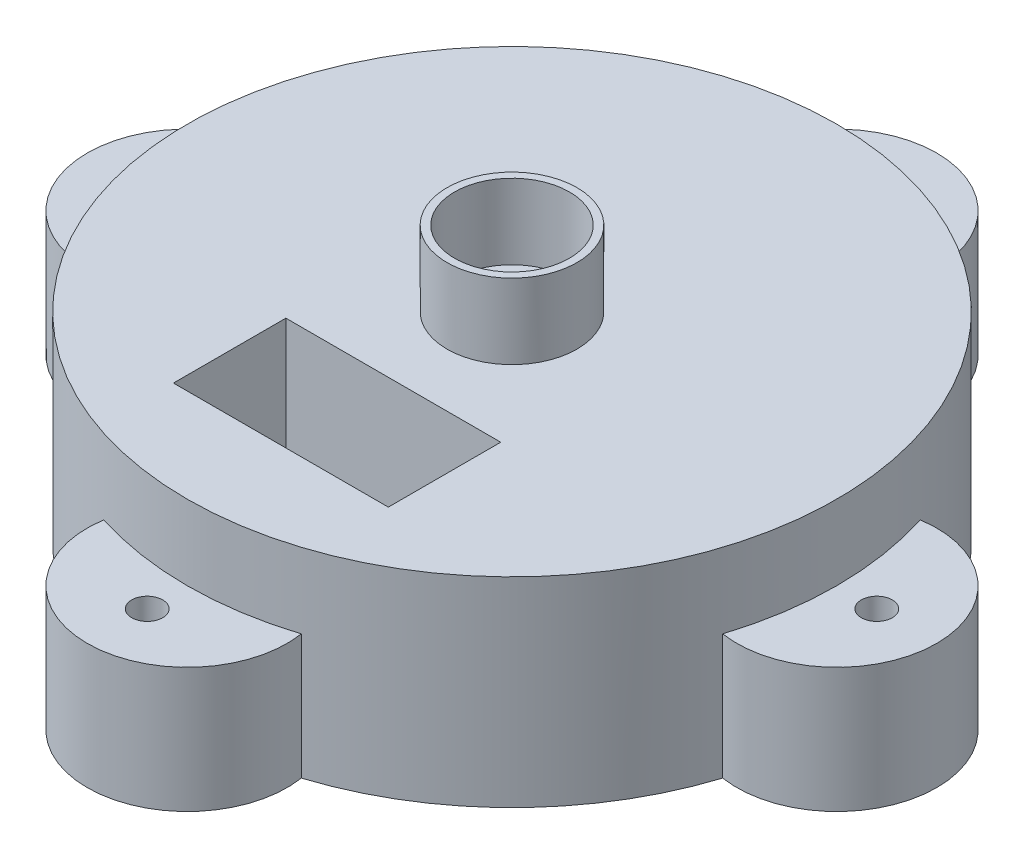
ISO-10303-21;
HEADER;
FILE_DESCRIPTION(('STEP AP214'),'2;1');
FILE_NAME('part.step','',(''),(''),'','','');
FILE_SCHEMA(('AUTOMOTIVE_DESIGN { 1 0 10303 214 1 1 1 1 }'));
ENDSEC;
DATA;
#1=APPLICATION_CONTEXT('core data for automotive mechanical design processes');
#2=APPLICATION_PROTOCOL_DEFINITION('international standard','automotive_design',2000,#1);
#3=PRODUCT_CONTEXT('',#1,'mechanical');
#4=PRODUCT('Part','Part','',(#3));
#5=PRODUCT_RELATED_PRODUCT_CATEGORY('part','',(#4));
#6=PRODUCT_DEFINITION_FORMATION('','',#4);
#7=PRODUCT_DEFINITION_CONTEXT('part definition',#1,'design');
#8=PRODUCT_DEFINITION('design','',#6,#7);
#9=PRODUCT_DEFINITION_SHAPE('','',#8);
#10=(LENGTH_UNIT() NAMED_UNIT(*) SI_UNIT(.MILLI.,.METRE.));
#11=(NAMED_UNIT(*) PLANE_ANGLE_UNIT() SI_UNIT($,.RADIAN.));
#12=(NAMED_UNIT(*) SI_UNIT($,.STERADIAN.) SOLID_ANGLE_UNIT());
#13=UNCERTAINTY_MEASURE_WITH_UNIT(LENGTH_MEASURE(1.E-05),#10,'distance_accuracy_value','');
#14=(GEOMETRIC_REPRESENTATION_CONTEXT(3) GLOBAL_UNCERTAINTY_ASSIGNED_CONTEXT((#13)) GLOBAL_UNIT_ASSIGNED_CONTEXT((#10,
#11,#12)) REPRESENTATION_CONTEXT('',''));
#15=CARTESIAN_POINT('',(0.,0.,0.));
#16=DIRECTION('',(0.,0.,1.));
#17=DIRECTION('',(1.,0.,0.));
#18=AXIS2_PLACEMENT_3D('',#15,#16,#17);
#19=CARTESIAN_POINT('',(0.,40.,0.));
#20=DIRECTION('',(0.,-1.,0.));
#21=DIRECTION('',(0.,0.,-1.));
#22=AXIS2_PLACEMENT_3D('',#19,#20,#21);
#23=CYLINDRICAL_SURFACE('',#22,65.);
#24=DIRECTION('',(0.,-1.,0.));
#25=VECTOR('',#24,1.);
#26=CARTESIAN_POINT('',(61.9230515913332,25.,19.7619756506552));
#27=LINE('',#26,#25);
#28=CARTESIAN_POINT('',(61.9230515913332,25.,19.7619756506552));
#29=VERTEX_POINT('',#28);
#30=CARTESIAN_POINT('',(61.9230515913332,0.,19.7619756506552));
#31=VERTEX_POINT('',#30);
#32=EDGE_CURVE('E202',#29,#31,#27,.T.);
#33=ORIENTED_EDGE('',*,*,#32,.F.);
#34=CARTESIAN_POINT('',(0.,25.,0.));
#35=DIRECTION('',(0.,-1.,0.));
#36=DIRECTION('',(0.,0.,-1.));
#37=AXIS2_PLACEMENT_3D('',#34,#35,#36);
#38=CIRCLE('',#37,65.);
#39=CARTESIAN_POINT('',(61.9231022547189,25.,-19.7618168990512));
#40=VERTEX_POINT('',#39);
#41=EDGE_CURVE('E195',#40,#29,#38,.T.);
#42=ORIENTED_EDGE('',*,*,#41,.F.);
#43=DIRECTION('',(0.,-1.,0.));
#44=VECTOR('',#43,1.);
#45=CARTESIAN_POINT('',(61.9231022547189,25.,-19.7618168990512));
#46=LINE('',#45,#44);
#47=CARTESIAN_POINT('',(61.9231022547189,0.,-19.7618168990512));
#48=VERTEX_POINT('',#47);
#49=EDGE_CURVE('E207',#40,#48,#46,.T.);
#50=ORIENTED_EDGE('',*,*,#49,.T.);
#51=CARTESIAN_POINT('',(0.,0.,0.));
#52=DIRECTION('',(0.,1.,0.));
#53=DIRECTION('',(0.,0.,1.));
#54=AXIS2_PLACEMENT_3D('',#51,#52,#53);
#55=CIRCLE('',#54,65.);
#56=CARTESIAN_POINT('',(19.761975650655,0.,-61.9230515913333));
#57=VERTEX_POINT('',#56);
#58=EDGE_CURVE('E309',#48,#57,#55,.T.);
#59=ORIENTED_EDGE('',*,*,#58,.T.);
#60=DIRECTION('',(0.,-1.,0.));
#61=VECTOR('',#60,1.);
#62=CARTESIAN_POINT('',(19.761975650655,25.,-61.9230515913333));
#63=LINE('',#62,#61);
#64=CARTESIAN_POINT('',(19.761975650655,25.,-61.9230515913333));
#65=VERTEX_POINT('',#64);
#66=EDGE_CURVE('E223',#65,#57,#63,.T.);
#67=ORIENTED_EDGE('',*,*,#66,.F.);
#68=CARTESIAN_POINT('',(0.,25.,0.));
#69=DIRECTION('',(0.,-1.,0.));
#70=DIRECTION('',(0.,0.,-1.));
#71=AXIS2_PLACEMENT_3D('',#68,#69,#70);
#72=CIRCLE('',#71,65.);
#73=CARTESIAN_POINT('',(-19.7618168990514,25.,-61.9231022547188));
#74=VERTEX_POINT('',#73);
#75=EDGE_CURVE('E216',#74,#65,#72,.T.);
#76=ORIENTED_EDGE('',*,*,#75,.F.);
#77=DIRECTION('',(0.,-1.,0.));
#78=VECTOR('',#77,1.);
#79=CARTESIAN_POINT('',(-19.7618168990514,25.,-61.9231022547188));
#80=LINE('',#79,#78);
#81=CARTESIAN_POINT('',(-19.7618168990514,0.,-61.9231022547188));
#82=VERTEX_POINT('',#81);
#83=EDGE_CURVE('E228',#74,#82,#80,.T.);
#84=ORIENTED_EDGE('',*,*,#83,.T.);
#85=CARTESIAN_POINT('',(-61.9230515913333,0.,-19.7619756506548));
#86=VERTEX_POINT('',#85);
#87=EDGE_CURVE('E311',#82,#86,#55,.T.);
#88=ORIENTED_EDGE('',*,*,#87,.T.);
#89=DIRECTION('',(0.,-1.,0.));
#90=VECTOR('',#89,1.);
#91=CARTESIAN_POINT('',(-61.9230515913333,25.,-19.7619756506548));
#92=LINE('',#91,#90);
#93=CARTESIAN_POINT('',(-61.9230515913333,25.,-19.7619756506548));
#94=VERTEX_POINT('',#93);
#95=EDGE_CURVE('E244',#94,#86,#92,.T.);
#96=ORIENTED_EDGE('',*,*,#95,.F.);
#97=CARTESIAN_POINT('',(0.,25.,0.));
#98=DIRECTION('',(0.,-1.,0.));
#99=DIRECTION('',(0.,0.,-1.));
#100=AXIS2_PLACEMENT_3D('',#97,#98,#99);
#101=CIRCLE('',#100,65.);
#102=CARTESIAN_POINT('',(-61.9231022547188,25.,19.7618168990516));
#103=VERTEX_POINT('',#102);
#104=EDGE_CURVE('E237',#103,#94,#101,.T.);
#105=ORIENTED_EDGE('',*,*,#104,.F.);
#106=DIRECTION('',(0.,-1.,0.));
#107=VECTOR('',#106,1.);
#108=CARTESIAN_POINT('',(-61.9231022547188,25.,19.7618168990516));
#109=LINE('',#108,#107);
#110=CARTESIAN_POINT('',(-61.9231022547188,0.,19.7618168990516));
#111=VERTEX_POINT('',#110);
#112=EDGE_CURVE('E249',#103,#111,#109,.T.);
#113=ORIENTED_EDGE('',*,*,#112,.T.);
#114=CARTESIAN_POINT('',(-19.7619756506545,0.,61.9230515913334));
#115=VERTEX_POINT('',#114);
#116=EDGE_CURVE('E306',#111,#115,#55,.T.);
#117=ORIENTED_EDGE('',*,*,#116,.T.);
#118=DIRECTION('',(0.,-1.,0.));
#119=VECTOR('',#118,1.);
#120=CARTESIAN_POINT('',(-19.7619756506545,25.,61.9230515913334));
#121=LINE('',#120,#119);
#122=CARTESIAN_POINT('',(-19.7619756506545,25.,61.9230515913334));
#123=VERTEX_POINT('',#122);
#124=EDGE_CURVE('E265',#123,#115,#121,.T.);
#125=ORIENTED_EDGE('',*,*,#124,.F.);
#126=CARTESIAN_POINT('',(0.,25.,0.));
#127=DIRECTION('',(0.,-1.,0.));
#128=DIRECTION('',(0.,0.,-1.));
#129=AXIS2_PLACEMENT_3D('',#126,#127,#128);
#130=CIRCLE('',#129,65.);
#131=CARTESIAN_POINT('',(19.7618168990518,25.,61.9231022547187));
#132=VERTEX_POINT('',#131);
#133=EDGE_CURVE('E262',#132,#123,#130,.T.);
#134=ORIENTED_EDGE('',*,*,#133,.F.);
#135=DIRECTION('',(0.,-1.,0.));
#136=VECTOR('',#135,1.);
#137=CARTESIAN_POINT('',(19.7618168990518,25.,61.9231022547187));
#138=LINE('',#137,#136);
#139=CARTESIAN_POINT('',(19.7618168990518,0.,61.9231022547187));
#140=VERTEX_POINT('',#139);
#141=EDGE_CURVE('E270',#132,#140,#138,.T.);
#142=ORIENTED_EDGE('',*,*,#141,.T.);
#143=EDGE_CURVE('E308',#140,#31,#55,.T.);
#144=ORIENTED_EDGE('',*,*,#143,.T.);
#145=EDGE_LOOP('',(#33,#42,#50,#59,#67,#76,#84,#88,#96,#105,#113,#117,#125,#134,#142,#144));
#146=FACE_BOUND('',#145,.T.);
#147=CARTESIAN_POINT('',(0.,40.,0.));
#148=DIRECTION('',(0.,1.,0.));
#149=DIRECTION('',(0.,0.,1.));
#150=AXIS2_PLACEMENT_3D('',#147,#148,#149);
#151=CIRCLE('',#150,65.);
#152=CARTESIAN_POINT('',(0.,40.,65.));
#153=VERTEX_POINT('',#152);
#154=EDGE_CURVE('E42',#153,#153,#151,.T.);
#155=ORIENTED_EDGE('',*,*,#154,.F.);
#156=EDGE_LOOP('',(#155));
#157=FACE_BOUND('',#156,.T.);
#158=DIRECTION('',(0.,-1.,0.));
#159=VECTOR('',#158,1.);
#160=CARTESIAN_POINT('',(-58.4024663648858,40.,28.5333475515648));
#161=LINE('',#160,#159);
#162=CARTESIAN_POINT('',(-58.4024663648858,12.326049230071,28.5333475515648));
#163=VERTEX_POINT('',#162);
#164=CARTESIAN_POINT('',(-58.4024663648858,7.32604923007102,28.5333475515648));
#165=VERTEX_POINT('',#164);
#166=EDGE_CURVE('E150',#163,#165,#161,.T.);
#167=ORIENTED_EDGE('',*,*,#166,.F.);
#168=CARTESIAN_POINT('',(0.,12.326049230071,0.));
#169=DIRECTION('',(0.,-1.,0.));
#170=DIRECTION('',(0.,0.,-1.));
#171=AXIS2_PLACEMENT_3D('',#168,#169,#170);
#172=CIRCLE('',#171,65.);
#173=CARTESIAN_POINT('',(-48.2684954287439,12.326049230071,43.5333475515648));
#174=VERTEX_POINT('',#173);
#175=EDGE_CURVE('E153',#174,#163,#172,.T.);
#176=ORIENTED_EDGE('',*,*,#175,.F.);
#177=DIRECTION('',(0.,-1.,0.));
#178=VECTOR('',#177,1.);
#179=CARTESIAN_POINT('',(-48.2684954287439,40.,43.5333475515648));
#180=LINE('',#179,#178);
#181=CARTESIAN_POINT('',(-48.2684954287439,7.32604923007102,43.5333475515648));
#182=VERTEX_POINT('',#181);
#183=EDGE_CURVE('E177',#182,#174,#180,.F.);
#184=ORIENTED_EDGE('',*,*,#183,.F.);
#185=CARTESIAN_POINT('',(0.,7.32604923007102,0.));
#186=DIRECTION('',(0.,1.,0.));
#187=DIRECTION('',(0.,0.,1.));
#188=AXIS2_PLACEMENT_3D('',#185,#186,#187);
#189=CIRCLE('',#188,65.);
#190=EDGE_CURVE('E179',#165,#182,#189,.T.);
#191=ORIENTED_EDGE('',*,*,#190,.F.);
#192=EDGE_LOOP('',(#167,#176,#184,#191));
#193=FACE_BOUND('',#192,.T.);
#194=ADVANCED_FACE('F35',(#146,#157,#193),#23,.T.);
#195=CARTESIAN_POINT('',(-21.5,2.,23.75));
#196=DIRECTION('',(1.,0.,0.));
#197=DIRECTION('',(0.,0.,-1.));
#198=AXIS2_PLACEMENT_3D('',#195,#196,#197);
#199=PLANE('',#198);
#200=DIRECTION('',(0.,0.,-1.));
#201=VECTOR('',#200,1.);
#202=CARTESIAN_POINT('',(-21.5,40.,23.75));
#203=LINE('',#202,#201);
#204=CARTESIAN_POINT('',(-21.5,40.,46.25));
#205=VERTEX_POINT('',#204);
#206=CARTESIAN_POINT('',(-21.5,40.,23.75));
#207=VERTEX_POINT('',#206);
#208=EDGE_CURVE('E273',#205,#207,#203,.T.);
#209=ORIENTED_EDGE('',*,*,#208,.F.);
#210=DIRECTION('',(0.,1.,0.));
#211=VECTOR('',#210,1.);
#212=CARTESIAN_POINT('',(-21.5,2.,46.25));
#213=LINE('',#212,#211);
#214=CARTESIAN_POINT('',(-21.5,2.,46.25));
#215=VERTEX_POINT('',#214);
#216=EDGE_CURVE('E286',#215,#205,#213,.T.);
#217=ORIENTED_EDGE('',*,*,#216,.F.);
#218=DIRECTION('',(0.,0.,-1.));
#219=VECTOR('',#218,1.);
#220=CARTESIAN_POINT('',(-21.5,2.,23.75));
#221=LINE('',#220,#219);
#222=CARTESIAN_POINT('',(-21.5,2.,23.75));
#223=VERTEX_POINT('',#222);
#224=EDGE_CURVE('E276',#215,#223,#221,.T.);
#225=ORIENTED_EDGE('',*,*,#224,.T.);
#226=DIRECTION('',(0.,1.,0.));
#227=VECTOR('',#226,1.);
#228=CARTESIAN_POINT('',(-21.5,2.,23.75));
#229=LINE('',#228,#227);
#230=EDGE_CURVE('E303',#223,#207,#229,.T.);
#231=ORIENTED_EDGE('',*,*,#230,.T.);
#232=EDGE_LOOP('',(#209,#217,#225,#231));
#233=FACE_BOUND('',#232,.T.);
#234=DIRECTION('',(0.,0.,-1.));
#235=VECTOR('',#234,1.);
#236=CARTESIAN_POINT('',(-21.5,12.326049230071,43.5333475515648));
#237=LINE('',#236,#235);
#238=CARTESIAN_POINT('',(-21.5,12.326049230071,43.5333475515648));
#239=VERTEX_POINT('',#238);
#240=CARTESIAN_POINT('',(-21.5,12.326049230071,28.5333475515648));
#241=VERTEX_POINT('',#240);
#242=EDGE_CURVE('E167',#239,#241,#237,.T.);
#243=ORIENTED_EDGE('',*,*,#242,.T.);
#244=DIRECTION('',(0.,-1.,0.));
#245=VECTOR('',#244,1.);
#246=CARTESIAN_POINT('',(-21.5,7.32604923007102,28.5333475515648));
#247=LINE('',#246,#245);
#248=CARTESIAN_POINT('',(-21.5,7.32604923007102,28.5333475515648));
#249=VERTEX_POINT('',#248);
#250=EDGE_CURVE('E57',#241,#249,#247,.T.);
#251=ORIENTED_EDGE('',*,*,#250,.T.);
#252=DIRECTION('',(0.,0.,1.));
#253=VECTOR('',#252,1.);
#254=CARTESIAN_POINT('',(-21.5,7.32604923007102,43.5333475515648));
#255=LINE('',#254,#253);
#256=CARTESIAN_POINT('',(-21.5,7.32604923007102,43.5333475515648));
#257=VERTEX_POINT('',#256);
#258=EDGE_CURVE('E157',#249,#257,#255,.T.);
#259=ORIENTED_EDGE('',*,*,#258,.T.);
#260=DIRECTION('',(0.,1.,0.));
#261=VECTOR('',#260,1.);
#262=CARTESIAN_POINT('',(-21.5,7.32604923007102,43.5333475515648));
#263=LINE('',#262,#261);
#264=EDGE_CURVE('E163',#257,#239,#263,.T.);
#265=ORIENTED_EDGE('',*,*,#264,.T.);
#266=EDGE_LOOP('',(#243,#251,#259,#265));
#267=FACE_BOUND('',#266,.T.);
#268=ADVANCED_FACE('F166',(#233,#267),#199,.T.);
#269=CARTESIAN_POINT('',(0.,40.,0.));
#270=DIRECTION('',(0.,1.,0.));
#271=DIRECTION('',(0.,0.,1.));
#272=AXIS2_PLACEMENT_3D('',#269,#270,#271);
#273=PLANE('',#272);
#274=CARTESIAN_POINT('',(0.,40.,0.));
#275=DIRECTION('',(0.,1.,0.));
#276=DIRECTION('',(0.,0.,1.));
#277=AXIS2_PLACEMENT_3D('',#274,#275,#276);
#278=CIRCLE('',#277,13.);
#279=CARTESIAN_POINT('',(0.,40.,13.));
#280=VERTEX_POINT('',#279);
#281=EDGE_CURVE('E11',#280,#280,#278,.T.);
#282=ORIENTED_EDGE('',*,*,#281,.F.);
#283=EDGE_LOOP('',(#282));
#284=FACE_BOUND('',#283,.T.);
#285=ORIENTED_EDGE('',*,*,#154,.T.);
#286=EDGE_LOOP('',(#285));
#287=FACE_BOUND('',#286,.T.);
#288=DIRECTION('',(-1.,0.,0.));
#289=VECTOR('',#288,1.);
#290=CARTESIAN_POINT('',(21.5,40.,46.25));
#291=LINE('',#290,#289);
#292=CARTESIAN_POINT('',(21.5,40.,46.25));
#293=VERTEX_POINT('',#292);
#294=EDGE_CURVE('E280',#293,#205,#291,.T.);
#295=ORIENTED_EDGE('',*,*,#294,.T.);
#296=ORIENTED_EDGE('',*,*,#208,.T.);
#297=DIRECTION('',(1.,0.,0.));
#298=VECTOR('',#297,1.);
#299=CARTESIAN_POINT('',(21.5,40.,23.75));
#300=LINE('',#299,#298);
#301=CARTESIAN_POINT('',(21.5,40.,23.75));
#302=VERTEX_POINT('',#301);
#303=EDGE_CURVE('E289',#207,#302,#300,.T.);
#304=ORIENTED_EDGE('',*,*,#303,.T.);
#305=DIRECTION('',(0.,0.,1.));
#306=VECTOR('',#305,1.);
#307=CARTESIAN_POINT('',(21.5,40.,23.75));
#308=LINE('',#307,#306);
#309=EDGE_CURVE('E292',#302,#293,#308,.T.);
#310=ORIENTED_EDGE('',*,*,#309,.T.);
#311=EDGE_LOOP('',(#295,#296,#304,#310));
#312=FACE_BOUND('',#311,.T.);
#313=ADVANCED_FACE('F341',(#284,#287,#312),#273,.T.);
#314=CARTESIAN_POINT('',(0.,0.,0.));
#315=DIRECTION('',(0.,1.,0.));
#316=DIRECTION('',(0.,0.,1.));
#317=AXIS2_PLACEMENT_3D('',#314,#315,#316);
#318=PLANE('',#317);
#319=ORIENTED_EDGE('',*,*,#143,.F.);
#320=CARTESIAN_POINT('',(-8.33199405442242E-05,0.,64.9999999999466));
#321=DIRECTION('',(0.,-1.,0.));
#322=DIRECTION('',(0.,0.,-1.));
#323=AXIS2_PLACEMENT_3D('',#320,#321,#322);
#324=CIRCLE('',#323,20.);
#325=EDGE_CURVE('E259',#115,#140,#324,.F.);
#326=ORIENTED_EDGE('',*,*,#325,.F.);
#327=ORIENTED_EDGE('',*,*,#116,.F.);
#328=CARTESIAN_POINT('',(-64.9999999999466,0.,-8.33199407711705E-05));
#329=DIRECTION('',(0.,-1.,0.));
#330=DIRECTION('',(0.,0.,-1.));
#331=AXIS2_PLACEMENT_3D('',#328,#329,#330);
#332=CIRCLE('',#331,20.);
#333=EDGE_CURVE('E231',#86,#111,#332,.F.);
#334=ORIENTED_EDGE('',*,*,#333,.F.);
#335=ORIENTED_EDGE('',*,*,#87,.F.);
#336=CARTESIAN_POINT('',(8.33199409981168E-05,0.,-64.9999999999466));
#337=DIRECTION('',(0.,-1.,0.));
#338=DIRECTION('',(0.,0.,-1.));
#339=AXIS2_PLACEMENT_3D('',#336,#337,#338);
#340=CIRCLE('',#339,20.);
#341=EDGE_CURVE('E210',#57,#82,#340,.F.);
#342=ORIENTED_EDGE('',*,*,#341,.F.);
#343=ORIENTED_EDGE('',*,*,#58,.F.);
#344=CARTESIAN_POINT('',(64.9999999999466,0.,8.33199412250631E-05));
#345=DIRECTION('',(0.,-1.,0.));
#346=DIRECTION('',(0.,0.,-1.));
#347=AXIS2_PLACEMENT_3D('',#344,#345,#346);
#348=CIRCLE('',#347,20.);
#349=EDGE_CURVE('E191',#31,#48,#348,.F.);
#350=ORIENTED_EDGE('',*,*,#349,.F.);
#351=EDGE_LOOP('',(#319,#326,#327,#334,#335,#342,#343,#350));
#352=FACE_BOUND('',#351,.T.);
#353=CARTESIAN_POINT('',(-8.33199405432445E-05,0.,72.9999999999466));
#354=DIRECTION('',(0.,-1.,0.));
#355=DIRECTION('',(0.,0.,-1.));
#356=AXIS2_PLACEMENT_3D('',#353,#354,#355);
#357=CIRCLE('',#356,3.1);
#358=CARTESIAN_POINT('',(-8.33199405432445E-05,0.,69.8999999999466));
#359=VERTEX_POINT('',#358);
#360=EDGE_CURVE('E252',#359,#359,#357,.F.);
#361=ORIENTED_EDGE('',*,*,#360,.T.);
#362=EDGE_LOOP('',(#361));
#363=FACE_BOUND('',#362,.T.);
#364=CARTESIAN_POINT('',(-72.9999999999466,0.,-8.33199407981226E-05));
#365=DIRECTION('',(0.,-1.,0.));
#366=DIRECTION('',(0.,0.,-1.));
#367=AXIS2_PLACEMENT_3D('',#364,#365,#366);
#368=CIRCLE('',#367,3.1);
#369=CARTESIAN_POINT('',(-72.9999999999466,0.,-3.1000833199408));
#370=VERTEX_POINT('',#369);
#371=EDGE_CURVE('E238',#370,#370,#368,.F.);
#372=ORIENTED_EDGE('',*,*,#371,.T.);
#373=EDGE_LOOP('',(#372));
#374=FACE_BOUND('',#373,.T.);
#375=CARTESIAN_POINT('',(8.33199410530008E-05,0.,-72.9999999999466));
#376=DIRECTION('',(0.,-1.,0.));
#377=DIRECTION('',(0.,0.,-1.));
#378=AXIS2_PLACEMENT_3D('',#375,#376,#377);
#379=CIRCLE('',#378,3.1);
#380=CARTESIAN_POINT('',(8.33199410530008E-05,0.,-76.0999999999466));
#381=VERTEX_POINT('',#380);
#382=EDGE_CURVE('E217',#381,#381,#379,.F.);
#383=ORIENTED_EDGE('',*,*,#382,.T.);
#384=EDGE_LOOP('',(#383));
#385=FACE_BOUND('',#384,.T.);
#386=CARTESIAN_POINT('',(72.9999999999466,0.,8.33199413078789E-05));
#387=DIRECTION('',(0.,-1.,0.));
#388=DIRECTION('',(0.,0.,-1.));
#389=AXIS2_PLACEMENT_3D('',#386,#387,#388);
#390=CIRCLE('',#389,3.1);
#391=CARTESIAN_POINT('',(72.9999999999466,0.,-3.09991668005869));
#392=VERTEX_POINT('',#391);
#393=EDGE_CURVE('E196',#392,#392,#390,.F.);
#394=ORIENTED_EDGE('',*,*,#393,.T.);
#395=EDGE_LOOP('',(#394));
#396=FACE_BOUND('',#395,.T.);
#397=ADVANCED_FACE('F321',(#352,#363,#374,#385,#396),#318,.F.);
#398=CARTESIAN_POINT('',(21.5,2.,23.75));
#399=DIRECTION('',(0.,0.,1.));
#400=DIRECTION('',(1.,0.,0.));
#401=AXIS2_PLACEMENT_3D('',#398,#399,#400);
#402=PLANE('',#401);
#403=ORIENTED_EDGE('',*,*,#303,.F.);
#404=ORIENTED_EDGE('',*,*,#230,.F.);
#405=DIRECTION('',(1.,0.,0.));
#406=VECTOR('',#405,1.);
#407=CARTESIAN_POINT('',(21.5,2.,23.75));
#408=LINE('',#407,#406);
#409=CARTESIAN_POINT('',(21.5,2.,23.75));
#410=VERTEX_POINT('',#409);
#411=EDGE_CURVE('E279',#223,#410,#408,.T.);
#412=ORIENTED_EDGE('',*,*,#411,.T.);
#413=DIRECTION('',(0.,1.,0.));
#414=VECTOR('',#413,1.);
#415=CARTESIAN_POINT('',(21.5,2.,23.75));
#416=LINE('',#415,#414);
#417=EDGE_CURVE('E301',#410,#302,#416,.T.);
#418=ORIENTED_EDGE('',*,*,#417,.T.);
#419=EDGE_LOOP('',(#403,#404,#412,#418));
#420=FACE_BOUND('',#419,.T.);
#421=ADVANCED_FACE('F340',(#420),#402,.T.);
#422=CARTESIAN_POINT('',(21.5,2.,23.75));
#423=DIRECTION('',(-1.,0.,0.));
#424=DIRECTION('',(0.,0.,1.));
#425=AXIS2_PLACEMENT_3D('',#422,#423,#424);
#426=PLANE('',#425);
#427=ORIENTED_EDGE('',*,*,#309,.F.);
#428=ORIENTED_EDGE('',*,*,#417,.F.);
#429=DIRECTION('',(0.,0.,1.));
#430=VECTOR('',#429,1.);
#431=CARTESIAN_POINT('',(21.5,2.,23.75));
#432=LINE('',#431,#430);
#433=CARTESIAN_POINT('',(21.5,2.,46.25));
#434=VERTEX_POINT('',#433);
#435=EDGE_CURVE('E282',#410,#434,#432,.T.);
#436=ORIENTED_EDGE('',*,*,#435,.T.);
#437=DIRECTION('',(0.,1.,0.));
#438=VECTOR('',#437,1.);
#439=CARTESIAN_POINT('',(21.5,2.,46.25));
#440=LINE('',#439,#438);
#441=EDGE_CURVE('E299',#434,#293,#440,.T.);
#442=ORIENTED_EDGE('',*,*,#441,.T.);
#443=EDGE_LOOP('',(#427,#428,#436,#442));
#444=FACE_BOUND('',#443,.T.);
#445=ADVANCED_FACE('F377',(#444),#426,.T.);
#446=CARTESIAN_POINT('',(21.5,2.,46.25));
#447=DIRECTION('',(0.,0.,-1.));
#448=DIRECTION('',(0.,1.,0.));
#449=AXIS2_PLACEMENT_3D('',#446,#447,#448);
#450=PLANE('',#449);
#451=ORIENTED_EDGE('',*,*,#294,.F.);
#452=ORIENTED_EDGE('',*,*,#441,.F.);
#453=DIRECTION('',(-1.,0.,0.));
#454=VECTOR('',#453,1.);
#455=CARTESIAN_POINT('',(21.5,2.,46.25));
#456=LINE('',#455,#454);
#457=EDGE_CURVE('E284',#434,#215,#456,.T.);
#458=ORIENTED_EDGE('',*,*,#457,.T.);
#459=ORIENTED_EDGE('',*,*,#216,.T.);
#460=EDGE_LOOP('',(#451,#452,#458,#459));
#461=FACE_BOUND('',#460,.T.);
#462=ADVANCED_FACE('F381',(#461),#450,.T.);
#463=CARTESIAN_POINT('',(0.,2.,0.));
#464=DIRECTION('',(0.,-1.,0.));
#465=DIRECTION('',(0.,0.,-1.));
#466=AXIS2_PLACEMENT_3D('',#463,#464,#465);
#467=PLANE('',#466);
#468=ORIENTED_EDGE('',*,*,#224,.F.);
#469=ORIENTED_EDGE('',*,*,#457,.F.);
#470=ORIENTED_EDGE('',*,*,#435,.F.);
#471=ORIENTED_EDGE('',*,*,#411,.F.);
#472=EDGE_LOOP('',(#468,#469,#470,#471));
#473=FACE_BOUND('',#472,.T.);
#474=ADVANCED_FACE('F385',(#473),#467,.F.);
#475=CARTESIAN_POINT('',(-8.33199405442242E-05,25.,64.9999999999466));
#476=DIRECTION('',(0.,-1.,0.));
#477=DIRECTION('',(0.,0.,-1.));
#478=AXIS2_PLACEMENT_3D('',#475,#476,#477);
#479=CYLINDRICAL_SURFACE('',#478,20.);
#480=ORIENTED_EDGE('',*,*,#325,.T.);
#481=ORIENTED_EDGE('',*,*,#141,.F.);
#482=CARTESIAN_POINT('',(-8.33199405442242E-05,25.,64.9999999999466));
#483=DIRECTION('',(0.,-1.,0.));
#484=DIRECTION('',(0.,0.,-1.));
#485=AXIS2_PLACEMENT_3D('',#482,#483,#484);
#486=CIRCLE('',#485,20.);
#487=EDGE_CURVE('E258',#123,#132,#486,.F.);
#488=ORIENTED_EDGE('',*,*,#487,.F.);
#489=ORIENTED_EDGE('',*,*,#124,.T.);
#490=EDGE_LOOP('',(#480,#481,#488,#489));
#491=FACE_BOUND('',#490,.T.);
#492=ADVANCED_FACE('F389',(#491),#479,.T.);
#493=CARTESIAN_POINT('',(-8.33199405432445E-05,25.,72.9999999999466));
#494=DIRECTION('',(0.,-1.,0.));
#495=DIRECTION('',(0.,0.,-1.));
#496=AXIS2_PLACEMENT_3D('',#493,#494,#495);
#497=CYLINDRICAL_SURFACE('',#496,3.1);
#498=CARTESIAN_POINT('',(-8.33199405432445E-05,25.,72.9999999999466));
#499=DIRECTION('',(0.,-1.,0.));
#500=DIRECTION('',(0.,0.,-1.));
#501=AXIS2_PLACEMENT_3D('',#498,#499,#500);
#502=CIRCLE('',#501,3.1);
#503=CARTESIAN_POINT('',(-8.33199405432445E-05,25.,69.8999999999466));
#504=VERTEX_POINT('',#503);
#505=EDGE_CURVE('E255',#504,#504,#502,.F.);
#506=ORIENTED_EDGE('',*,*,#505,.T.);
#507=EDGE_LOOP('',(#506));
#508=FACE_BOUND('',#507,.T.);
#509=ORIENTED_EDGE('',*,*,#360,.F.);
#510=EDGE_LOOP('',(#509));
#511=FACE_BOUND('',#510,.T.);
#512=ADVANCED_FACE('F391',(#508,#511),#497,.F.);
#513=CARTESIAN_POINT('',(0.,25.,0.));
#514=DIRECTION('',(0.,-1.,0.));
#515=DIRECTION('',(0.,0.,-1.));
#516=AXIS2_PLACEMENT_3D('',#513,#514,#515);
#517=PLANE('',#516);
#518=ORIENTED_EDGE('',*,*,#505,.F.);
#519=EDGE_LOOP('',(#518));
#520=FACE_BOUND('',#519,.T.);
#521=ORIENTED_EDGE('',*,*,#487,.T.);
#522=ORIENTED_EDGE('',*,*,#133,.T.);
#523=EDGE_LOOP('',(#521,#522));
#524=FACE_BOUND('',#523,.T.);
#525=ADVANCED_FACE('F394',(#520,#524),#517,.F.);
#526=CARTESIAN_POINT('',(-64.9999999999466,25.,-8.33199407696397E-05));
#527=DIRECTION('',(0.,-1.,0.));
#528=DIRECTION('',(0.,0.,-1.));
#529=AXIS2_PLACEMENT_3D('',#526,#527,#528);
#530=CYLINDRICAL_SURFACE('',#529,20.);
#531=ORIENTED_EDGE('',*,*,#333,.T.);
#532=ORIENTED_EDGE('',*,*,#112,.F.);
#533=CARTESIAN_POINT('',(-64.9999999999466,25.,-8.33199407696397E-05));
#534=DIRECTION('',(0.,-1.,0.));
#535=DIRECTION('',(0.,0.,-1.));
#536=AXIS2_PLACEMENT_3D('',#533,#534,#535);
#537=CIRCLE('',#536,20.);
#538=EDGE_CURVE('E234',#94,#103,#537,.F.);
#539=ORIENTED_EDGE('',*,*,#538,.F.);
#540=ORIENTED_EDGE('',*,*,#95,.T.);
#541=EDGE_LOOP('',(#531,#532,#539,#540));
#542=FACE_BOUND('',#541,.T.);
#543=ADVANCED_FACE('F319',(#542),#530,.T.);
#544=CARTESIAN_POINT('',(-72.9999999999466,25.,-8.33199407965918E-05));
#545=DIRECTION('',(0.,-1.,0.));
#546=DIRECTION('',(0.,0.,-1.));
#547=AXIS2_PLACEMENT_3D('',#544,#545,#546);
#548=CYLINDRICAL_SURFACE('',#547,3.1);
#549=CARTESIAN_POINT('',(-72.9999999999466,25.,-8.33199407965918E-05));
#550=DIRECTION('',(0.,-1.,0.));
#551=DIRECTION('',(0.,0.,-1.));
#552=AXIS2_PLACEMENT_3D('',#549,#550,#551);
#553=CIRCLE('',#552,3.1);
#554=CARTESIAN_POINT('',(-72.9999999999466,25.,-3.1000833199408));
#555=VERTEX_POINT('',#554);
#556=EDGE_CURVE('E241',#555,#555,#553,.F.);
#557=ORIENTED_EDGE('',*,*,#556,.T.);
#558=EDGE_LOOP('',(#557));
#559=FACE_BOUND('',#558,.T.);
#560=ORIENTED_EDGE('',*,*,#371,.F.);
#561=EDGE_LOOP('',(#560));
#562=FACE_BOUND('',#561,.T.);
#563=ADVANCED_FACE('F329',(#559,#562),#548,.F.);
#564=CARTESIAN_POINT('',(0.,25.,0.));
#565=DIRECTION('',(0.,-1.,0.));
#566=DIRECTION('',(0.,0.,-1.));
#567=AXIS2_PLACEMENT_3D('',#564,#565,#566);
#568=PLANE('',#567);
#569=ORIENTED_EDGE('',*,*,#538,.T.);
#570=ORIENTED_EDGE('',*,*,#104,.T.);
#571=EDGE_LOOP('',(#569,#570));
#572=FACE_BOUND('',#571,.T.);
#573=ORIENTED_EDGE('',*,*,#556,.F.);
#574=EDGE_LOOP('',(#573));
#575=FACE_BOUND('',#574,.T.);
#576=ADVANCED_FACE('F325',(#572,#575),#568,.F.);
#577=CARTESIAN_POINT('',(8.33199409981168E-05,25.,-64.9999999999466));
#578=DIRECTION('',(0.,-1.,0.));
#579=DIRECTION('',(0.,0.,-1.));
#580=AXIS2_PLACEMENT_3D('',#577,#578,#579);
#581=CYLINDRICAL_SURFACE('',#580,20.);
#582=ORIENTED_EDGE('',*,*,#341,.T.);
#583=ORIENTED_EDGE('',*,*,#83,.F.);
#584=CARTESIAN_POINT('',(8.33199409981168E-05,25.,-64.9999999999466));
#585=DIRECTION('',(0.,-1.,0.));
#586=DIRECTION('',(0.,0.,-1.));
#587=AXIS2_PLACEMENT_3D('',#584,#585,#586);
#588=CIRCLE('',#587,20.);
#589=EDGE_CURVE('E213',#65,#74,#588,.F.);
#590=ORIENTED_EDGE('',*,*,#589,.F.);
#591=ORIENTED_EDGE('',*,*,#66,.T.);
#592=EDGE_LOOP('',(#582,#583,#590,#591));
#593=FACE_BOUND('',#592,.T.);
#594=ADVANCED_FACE('F328',(#593),#581,.T.);
#595=CARTESIAN_POINT('',(8.33199410530008E-05,25.,-72.9999999999466));
#596=DIRECTION('',(0.,-1.,0.));
#597=DIRECTION('',(0.,0.,-1.));
#598=AXIS2_PLACEMENT_3D('',#595,#596,#597);
#599=CYLINDRICAL_SURFACE('',#598,3.1);
#600=CARTESIAN_POINT('',(8.33199410530008E-05,25.,-72.9999999999466));
#601=DIRECTION('',(0.,-1.,0.));
#602=DIRECTION('',(0.,0.,-1.));
#603=AXIS2_PLACEMENT_3D('',#600,#601,#602);
#604=CIRCLE('',#603,3.1);
#605=CARTESIAN_POINT('',(8.33199410530008E-05,25.,-76.0999999999466));
#606=VERTEX_POINT('',#605);
#607=EDGE_CURVE('E220',#606,#606,#604,.F.);
#608=ORIENTED_EDGE('',*,*,#607,.T.);
#609=EDGE_LOOP('',(#608));
#610=FACE_BOUND('',#609,.T.);
#611=ORIENTED_EDGE('',*,*,#382,.F.);
#612=EDGE_LOOP('',(#611));
#613=FACE_BOUND('',#612,.T.);
#614=ADVANCED_FACE('F406',(#610,#613),#599,.F.);
#615=CARTESIAN_POINT('',(0.,25.,0.));
#616=DIRECTION('',(0.,-1.,0.));
#617=DIRECTION('',(0.,0.,-1.));
#618=AXIS2_PLACEMENT_3D('',#615,#616,#617);
#619=PLANE('',#618);
#620=ORIENTED_EDGE('',*,*,#589,.T.);
#621=ORIENTED_EDGE('',*,*,#75,.T.);
#622=EDGE_LOOP('',(#620,#621));
#623=FACE_BOUND('',#622,.T.);
#624=ORIENTED_EDGE('',*,*,#607,.F.);
#625=EDGE_LOOP('',(#624));
#626=FACE_BOUND('',#625,.T.);
#627=ADVANCED_FACE('F359',(#623,#626),#619,.F.);
#628=CARTESIAN_POINT('',(64.9999999999466,25.,8.33199412265939E-05));
#629=DIRECTION('',(0.,-1.,0.));
#630=DIRECTION('',(0.,0.,-1.));
#631=AXIS2_PLACEMENT_3D('',#628,#629,#630);
#632=CYLINDRICAL_SURFACE('',#631,20.);
#633=ORIENTED_EDGE('',*,*,#349,.T.);
#634=ORIENTED_EDGE('',*,*,#49,.F.);
#635=CARTESIAN_POINT('',(64.9999999999466,25.,8.33199412265939E-05));
#636=DIRECTION('',(0.,-1.,0.));
#637=DIRECTION('',(0.,0.,-1.));
#638=AXIS2_PLACEMENT_3D('',#635,#636,#637);
#639=CIRCLE('',#638,20.);
#640=EDGE_CURVE('E192',#29,#40,#639,.F.);
#641=ORIENTED_EDGE('',*,*,#640,.F.);
#642=ORIENTED_EDGE('',*,*,#32,.T.);
#643=EDGE_LOOP('',(#633,#634,#641,#642));
#644=FACE_BOUND('',#643,.T.);
#645=ADVANCED_FACE('F349',(#644),#632,.T.);
#646=CARTESIAN_POINT('',(72.9999999999466,25.,8.33199413094097E-05));
#647=DIRECTION('',(0.,-1.,0.));
#648=DIRECTION('',(0.,0.,-1.));
#649=AXIS2_PLACEMENT_3D('',#646,#647,#648);
#650=CYLINDRICAL_SURFACE('',#649,3.1);
#651=CARTESIAN_POINT('',(72.9999999999466,25.,8.33199413094097E-05));
#652=DIRECTION('',(0.,-1.,0.));
#653=DIRECTION('',(0.,0.,-1.));
#654=AXIS2_PLACEMENT_3D('',#651,#652,#653);
#655=CIRCLE('',#654,3.1);
#656=CARTESIAN_POINT('',(72.9999999999466,25.,-3.09991668005869));
#657=VERTEX_POINT('',#656);
#658=EDGE_CURVE('E199',#657,#657,#655,.F.);
#659=ORIENTED_EDGE('',*,*,#658,.T.);
#660=EDGE_LOOP('',(#659));
#661=FACE_BOUND('',#660,.T.);
#662=ORIENTED_EDGE('',*,*,#393,.F.);
#663=EDGE_LOOP('',(#662));
#664=FACE_BOUND('',#663,.T.);
#665=ADVANCED_FACE('F346',(#661,#664),#650,.F.);
#666=CARTESIAN_POINT('',(0.,25.,0.));
#667=DIRECTION('',(0.,-1.,0.));
#668=DIRECTION('',(0.,0.,-1.));
#669=AXIS2_PLACEMENT_3D('',#666,#667,#668);
#670=PLANE('',#669);
#671=ORIENTED_EDGE('',*,*,#640,.T.);
#672=ORIENTED_EDGE('',*,*,#41,.T.);
#673=EDGE_LOOP('',(#671,#672));
#674=FACE_BOUND('',#673,.T.);
#675=ORIENTED_EDGE('',*,*,#658,.F.);
#676=EDGE_LOOP('',(#675));
#677=FACE_BOUND('',#676,.T.);
#678=ADVANCED_FACE('F348',(#674,#677),#670,.F.);
#679=CARTESIAN_POINT('',(0.,55.,0.));
#680=DIRECTION('',(0.,-1.,0.));
#681=DIRECTION('',(0.,0.,-1.));
#682=AXIS2_PLACEMENT_3D('',#679,#680,#681);
#683=CYLINDRICAL_SURFACE('',#682,13.);
#684=CARTESIAN_POINT('',(0.,55.,0.));
#685=DIRECTION('',(0.,-1.,0.));
#686=DIRECTION('',(0.,0.,-1.));
#687=AXIS2_PLACEMENT_3D('',#684,#685,#686);
#688=CIRCLE('',#687,13.);
#689=CARTESIAN_POINT('',(0.,55.,-13.));
#690=VERTEX_POINT('',#689);
#691=EDGE_CURVE('E186',#690,#690,#688,.T.);
#692=ORIENTED_EDGE('',*,*,#691,.T.);
#693=EDGE_LOOP('',(#692));
#694=FACE_BOUND('',#693,.T.);
#695=ORIENTED_EDGE('',*,*,#281,.T.);
#696=EDGE_LOOP('',(#695));
#697=FACE_BOUND('',#696,.T.);
#698=ADVANCED_FACE('F356',(#694,#697),#683,.T.);
#699=CARTESIAN_POINT('',(0.,55.,0.));
#700=DIRECTION('',(0.,-1.,0.));
#701=DIRECTION('',(0.,0.,-1.));
#702=AXIS2_PLACEMENT_3D('',#699,#700,#701);
#703=PLANE('',#702);
#704=CARTESIAN_POINT('',(0.,55.,0.));
#705=DIRECTION('',(0.,-1.,0.));
#706=DIRECTION('',(0.,0.,-1.));
#707=AXIS2_PLACEMENT_3D('',#704,#705,#706);
#708=CIRCLE('',#707,11.5);
#709=CARTESIAN_POINT('',(0.,55.,-11.5));
#710=VERTEX_POINT('',#709);
#711=EDGE_CURVE('E183',#710,#710,#708,.T.);
#712=ORIENTED_EDGE('',*,*,#711,.T.);
#713=EDGE_LOOP('',(#712));
#714=FACE_BOUND('',#713,.T.);
#715=ORIENTED_EDGE('',*,*,#691,.F.);
#716=EDGE_LOOP('',(#715));
#717=FACE_BOUND('',#716,.T.);
#718=ADVANCED_FACE('F461',(#714,#717),#703,.F.);
#719=CARTESIAN_POINT('',(0.,55.,0.));
#720=DIRECTION('',(0.,-1.,0.));
#721=DIRECTION('',(0.,0.,-1.));
#722=AXIS2_PLACEMENT_3D('',#719,#720,#721);
#723=CYLINDRICAL_SURFACE('',#722,11.5);
#724=ORIENTED_EDGE('',*,*,#711,.F.);
#725=EDGE_LOOP('',(#724));
#726=FACE_BOUND('',#725,.T.);
#727=CARTESIAN_POINT('',(0.,40.,0.));
#728=DIRECTION('',(0.,-1.,0.));
#729=DIRECTION('',(0.,0.,-1.));
#730=AXIS2_PLACEMENT_3D('',#727,#728,#729);
#731=CIRCLE('',#730,11.5);
#732=CARTESIAN_POINT('',(0.,40.,-11.5));
#733=VERTEX_POINT('',#732);
#734=EDGE_CURVE('E182',#733,#733,#731,.T.);
#735=ORIENTED_EDGE('',*,*,#734,.T.);
#736=EDGE_LOOP('',(#735));
#737=FACE_BOUND('',#736,.T.);
#738=ADVANCED_FACE('F471',(#726,#737),#723,.F.);
#739=ORIENTED_EDGE('',*,*,#734,.F.);
#740=EDGE_LOOP('',(#739));
#741=FACE_BOUND('',#740,.T.);
#742=ADVANCED_FACE('F373',(#741),#273,.T.);
#743=CARTESIAN_POINT('',(-81.5,7.32604923007102,28.5333475515648));
#744=DIRECTION('',(0.,0.,1.));
#745=DIRECTION('',(1.,0.,0.));
#746=AXIS2_PLACEMENT_3D('',#743,#744,#745);
#747=PLANE('',#746);
#748=ORIENTED_EDGE('',*,*,#166,.T.);
#749=DIRECTION('',(1.,0.,0.));
#750=VECTOR('',#749,1.);
#751=CARTESIAN_POINT('',(-81.5,7.32604923007102,28.5333475515648));
#752=LINE('',#751,#750);
#753=EDGE_CURVE('E146',#165,#249,#752,.T.);
#754=ORIENTED_EDGE('',*,*,#753,.T.);
#755=ORIENTED_EDGE('',*,*,#250,.F.);
#756=DIRECTION('',(1.,0.,0.));
#757=VECTOR('',#756,1.);
#758=CARTESIAN_POINT('',(-81.5,12.326049230071,28.5333475515648));
#759=LINE('',#758,#757);
#760=EDGE_CURVE('E172',#163,#241,#759,.T.);
#761=ORIENTED_EDGE('',*,*,#760,.F.);
#762=EDGE_LOOP('',(#748,#754,#755,#761));
#763=FACE_BOUND('',#762,.T.);
#764=ADVANCED_FACE('F148',(#763),#747,.T.);
#765=CARTESIAN_POINT('',(-81.5,7.32604923007102,43.5333475515648));
#766=DIRECTION('',(0.,1.,0.));
#767=DIRECTION('',(0.,0.,1.));
#768=AXIS2_PLACEMENT_3D('',#765,#766,#767);
#769=PLANE('',#768);
#770=ORIENTED_EDGE('',*,*,#190,.T.);
#771=DIRECTION('',(1.,0.,0.));
#772=VECTOR('',#771,1.);
#773=CARTESIAN_POINT('',(-81.5,7.32604923007102,43.5333475515648));
#774=LINE('',#773,#772);
#775=EDGE_CURVE('E154',#182,#257,#774,.T.);
#776=ORIENTED_EDGE('',*,*,#775,.T.);
#777=ORIENTED_EDGE('',*,*,#258,.F.);
#778=ORIENTED_EDGE('',*,*,#753,.F.);
#779=EDGE_LOOP('',(#770,#776,#777,#778));
#780=FACE_BOUND('',#779,.T.);
#781=ADVANCED_FACE('F158',(#780),#769,.T.);
#782=CARTESIAN_POINT('',(-81.5,7.32604923007102,43.5333475515648));
#783=DIRECTION('',(0.,0.,-1.));
#784=DIRECTION('',(-1.,0.,0.));
#785=AXIS2_PLACEMENT_3D('',#782,#783,#784);
#786=PLANE('',#785);
#787=ORIENTED_EDGE('',*,*,#183,.T.);
#788=DIRECTION('',(1.,0.,0.));
#789=VECTOR('',#788,1.);
#790=CARTESIAN_POINT('',(-81.5,12.326049230071,43.5333475515648));
#791=LINE('',#790,#789);
#792=EDGE_CURVE('E49',#174,#239,#791,.T.);
#793=ORIENTED_EDGE('',*,*,#792,.T.);
#794=ORIENTED_EDGE('',*,*,#264,.F.);
#795=ORIENTED_EDGE('',*,*,#775,.F.);
#796=EDGE_LOOP('',(#787,#793,#794,#795));
#797=FACE_BOUND('',#796,.T.);
#798=ADVANCED_FACE('F513',(#797),#786,.T.);
#799=CARTESIAN_POINT('',(-81.5,12.326049230071,43.5333475515648));
#800=DIRECTION('',(0.,-1.,0.));
#801=DIRECTION('',(0.,0.,-1.));
#802=AXIS2_PLACEMENT_3D('',#799,#800,#801);
#803=PLANE('',#802);
#804=ORIENTED_EDGE('',*,*,#175,.T.);
#805=ORIENTED_EDGE('',*,*,#760,.T.);
#806=ORIENTED_EDGE('',*,*,#242,.F.);
#807=ORIENTED_EDGE('',*,*,#792,.F.);
#808=EDGE_LOOP('',(#804,#805,#806,#807));
#809=FACE_BOUND('',#808,.T.);
#810=ADVANCED_FACE('F522',(#809),#803,.T.);
#811=CLOSED_SHELL('',(#194,#268,#313,#397,#421,#445,#462,#474,#492,#512,#525,#543,#563,#576,
#594,#614,#627,#645,#665,#678,#698,#718,#738,#742,#764,#781,#798,#810));
#812=MANIFOLD_SOLID_BREP('B2',#811);
#813=ADVANCED_BREP_SHAPE_REPRESENTATION('',(#18,#812),#14);
#814=SHAPE_DEFINITION_REPRESENTATION(#9,#813);
ENDSEC;
END-ISO-10303-21;
